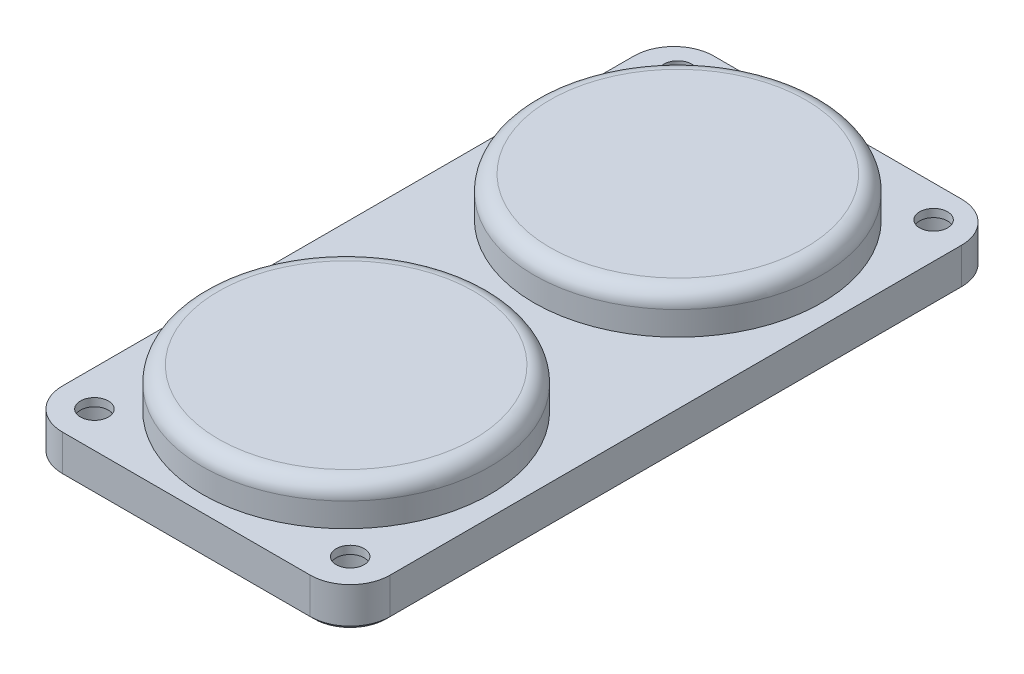
ISO-10303-21;
HEADER;
FILE_DESCRIPTION(('STEP AP214'),'2;1');
FILE_NAME('part.step','',(''),(''),'','','');
FILE_SCHEMA(('AUTOMOTIVE_DESIGN { 1 0 10303 214 1 1 1 1 }'));
ENDSEC;
DATA;
#1=APPLICATION_CONTEXT('core data for automotive mechanical design processes');
#2=APPLICATION_PROTOCOL_DEFINITION('international standard','automotive_design',2000,#1);
#3=PRODUCT_CONTEXT('',#1,'mechanical');
#4=PRODUCT('Part','Part','',(#3));
#5=PRODUCT_RELATED_PRODUCT_CATEGORY('part','',(#4));
#6=PRODUCT_DEFINITION_FORMATION('','',#4);
#7=PRODUCT_DEFINITION_CONTEXT('part definition',#1,'design');
#8=PRODUCT_DEFINITION('design','',#6,#7);
#9=PRODUCT_DEFINITION_SHAPE('','',#8);
#10=(LENGTH_UNIT() NAMED_UNIT(*) SI_UNIT(.MILLI.,.METRE.));
#11=(NAMED_UNIT(*) PLANE_ANGLE_UNIT() SI_UNIT($,.RADIAN.));
#12=(NAMED_UNIT(*) SI_UNIT($,.STERADIAN.) SOLID_ANGLE_UNIT());
#13=UNCERTAINTY_MEASURE_WITH_UNIT(LENGTH_MEASURE(1.E-05),#10,'distance_accuracy_value','');
#14=(GEOMETRIC_REPRESENTATION_CONTEXT(3) GLOBAL_UNCERTAINTY_ASSIGNED_CONTEXT((#13)) GLOBAL_UNIT_ASSIGNED_CONTEXT((#10,
#11,#12)) REPRESENTATION_CONTEXT('',''));
#15=CARTESIAN_POINT('',(0.,0.,0.));
#16=DIRECTION('',(0.,0.,1.));
#17=DIRECTION('',(1.,0.,0.));
#18=AXIS2_PLACEMENT_3D('',#15,#16,#17);
#19=CARTESIAN_POINT('',(-16.,0.,15.5));
#20=DIRECTION('',(0.,-1.,0.));
#21=DIRECTION('',(0.,0.,-1.));
#22=AXIS2_PLACEMENT_3D('',#19,#20,#21);
#23=CYLINDRICAL_SURFACE('',#22,1.75);
#24=CARTESIAN_POINT('',(-16.,0.,15.5));
#25=DIRECTION('',(0.,-1.,0.));
#26=DIRECTION('',(0.,0.,-1.));
#27=AXIS2_PLACEMENT_3D('',#24,#25,#26);
#28=CIRCLE('',#27,1.75);
#29=CARTESIAN_POINT('',(-16.,0.,13.75));
#30=VERTEX_POINT('',#29);
#31=EDGE_CURVE('E147',#30,#30,#28,.T.);
#32=ORIENTED_EDGE('',*,*,#31,.F.);
#33=EDGE_LOOP('',(#32));
#34=FACE_BOUND('',#33,.T.);
#35=CARTESIAN_POINT('',(-16.,-1.,15.5));
#36=DIRECTION('',(0.,-1.,0.));
#37=DIRECTION('',(0.,0.,-1.));
#38=AXIS2_PLACEMENT_3D('',#35,#36,#37);
#39=CIRCLE('',#38,1.75);
#40=CARTESIAN_POINT('',(-16.,-1.,13.75));
#41=VERTEX_POINT('',#40);
#42=EDGE_CURVE('E203',#41,#41,#39,.F.);
#43=ORIENTED_EDGE('',*,*,#42,.F.);
#44=EDGE_LOOP('',(#43));
#45=FACE_BOUND('',#44,.T.);
#46=ADVANCED_FACE('F35',(#34,#45),#23,.F.);
#47=CARTESIAN_POINT('',(-16.,0.,-57.4999999999999));
#48=DIRECTION('',(0.,-1.,0.));
#49=DIRECTION('',(0.,0.,-1.));
#50=AXIS2_PLACEMENT_3D('',#47,#48,#49);
#51=CYLINDRICAL_SURFACE('',#50,1.75);
#52=CARTESIAN_POINT('',(-16.,0.,-57.4999999999999));
#53=DIRECTION('',(0.,-1.,0.));
#54=DIRECTION('',(0.,0.,-1.));
#55=AXIS2_PLACEMENT_3D('',#52,#53,#54);
#56=CIRCLE('',#55,1.75);
#57=CARTESIAN_POINT('',(-16.,0.,-59.2499999999999));
#58=VERTEX_POINT('',#57);
#59=EDGE_CURVE('E144',#58,#58,#56,.T.);
#60=ORIENTED_EDGE('',*,*,#59,.F.);
#61=EDGE_LOOP('',(#60));
#62=FACE_BOUND('',#61,.T.);
#63=CARTESIAN_POINT('',(-16.,-1.,-57.4999999999999));
#64=DIRECTION('',(0.,-1.,0.));
#65=DIRECTION('',(0.,0.,-1.));
#66=AXIS2_PLACEMENT_3D('',#63,#64,#65);
#67=CIRCLE('',#66,1.75);
#68=CARTESIAN_POINT('',(-16.,-1.,-59.2499999999999));
#69=VERTEX_POINT('',#68);
#70=EDGE_CURVE('E200',#69,#69,#67,.F.);
#71=ORIENTED_EDGE('',*,*,#70,.F.);
#72=EDGE_LOOP('',(#71));
#73=FACE_BOUND('',#72,.T.);
#74=ADVANCED_FACE('F303',(#62,#73),#51,.F.);
#75=CARTESIAN_POINT('',(16.,0.,15.5));
#76=DIRECTION('',(0.,-1.,0.));
#77=DIRECTION('',(0.,0.,-1.));
#78=AXIS2_PLACEMENT_3D('',#75,#76,#77);
#79=CYLINDRICAL_SURFACE('',#78,1.75);
#80=CARTESIAN_POINT('',(16.,0.,15.5));
#81=DIRECTION('',(0.,1.,0.));
#82=DIRECTION('',(0.,0.,-1.));
#83=AXIS2_PLACEMENT_3D('',#80,#81,#82);
#84=CIRCLE('',#83,1.75);
#85=CARTESIAN_POINT('',(16.,0.,13.75));
#86=VERTEX_POINT('',#85);
#87=EDGE_CURVE('E280',#86,#86,#84,.T.);
#88=ORIENTED_EDGE('',*,*,#87,.T.);
#89=EDGE_LOOP('',(#88));
#90=FACE_BOUND('',#89,.T.);
#91=CARTESIAN_POINT('',(16.,-1.,15.5));
#92=DIRECTION('',(0.,-1.,0.));
#93=DIRECTION('',(0.,0.,-1.));
#94=AXIS2_PLACEMENT_3D('',#91,#92,#93);
#95=CIRCLE('',#94,1.75);
#96=CARTESIAN_POINT('',(16.,-1.,13.75));
#97=VERTEX_POINT('',#96);
#98=EDGE_CURVE('E196',#97,#97,#95,.T.);
#99=ORIENTED_EDGE('',*,*,#98,.T.);
#100=EDGE_LOOP('',(#99));
#101=FACE_BOUND('',#100,.T.);
#102=ADVANCED_FACE('F287',(#90,#101),#79,.F.);
#103=CARTESIAN_POINT('',(16.,0.,-57.4999999999999));
#104=DIRECTION('',(0.,-1.,0.));
#105=DIRECTION('',(0.,0.,-1.));
#106=AXIS2_PLACEMENT_3D('',#103,#104,#105);
#107=CYLINDRICAL_SURFACE('',#106,1.75);
#108=CARTESIAN_POINT('',(16.,0.,-57.4999999999999));
#109=DIRECTION('',(0.,1.,0.));
#110=DIRECTION('',(0.,0.,-1.));
#111=AXIS2_PLACEMENT_3D('',#108,#109,#110);
#112=CIRCLE('',#111,1.75);
#113=CARTESIAN_POINT('',(16.,0.,-59.2499999999999));
#114=VERTEX_POINT('',#113);
#115=EDGE_CURVE('E281',#114,#114,#112,.T.);
#116=ORIENTED_EDGE('',*,*,#115,.T.);
#117=EDGE_LOOP('',(#116));
#118=FACE_BOUND('',#117,.T.);
#119=CARTESIAN_POINT('',(16.,-1.,-57.4999999999999));
#120=DIRECTION('',(0.,-1.,0.));
#121=DIRECTION('',(0.,0.,-1.));
#122=AXIS2_PLACEMENT_3D('',#119,#120,#121);
#123=CIRCLE('',#122,1.75);
#124=CARTESIAN_POINT('',(16.,-1.,-59.2499999999999));
#125=VERTEX_POINT('',#124);
#126=EDGE_CURVE('E193',#125,#125,#123,.T.);
#127=ORIENTED_EDGE('',*,*,#126,.T.);
#128=EDGE_LOOP('',(#127));
#129=FACE_BOUND('',#128,.T.);
#130=ADVANCED_FACE('F347',(#118,#129),#107,.F.);
#131=CARTESIAN_POINT('',(-15.5,-5.,-56.5));
#132=DIRECTION('',(0.,1.,0.));
#133=DIRECTION('',(0.,0.,1.));
#134=AXIS2_PLACEMENT_3D('',#131,#132,#133);
#135=CYLINDRICAL_SURFACE('',#134,5.);
#136=DIRECTION('',(0.,1.,0.));
#137=VECTOR('',#136,1.);
#138=CARTESIAN_POINT('',(-15.5,-5.,-61.5));
#139=LINE('',#138,#137);
#140=CARTESIAN_POINT('',(-15.5,-4.49999999999999,-61.5));
#141=VERTEX_POINT('',#140);
#142=CARTESIAN_POINT('',(-15.5,0.,-61.5));
#143=VERTEX_POINT('',#142);
#144=EDGE_CURVE('E164',#141,#143,#139,.T.);
#145=ORIENTED_EDGE('',*,*,#144,.F.);
#146=CARTESIAN_POINT('',(-15.5,-4.49999999999999,-56.5));
#147=DIRECTION('',(0.,-1.,0.));
#148=DIRECTION('',(0.,0.,-1.));
#149=AXIS2_PLACEMENT_3D('',#146,#147,#148);
#150=CIRCLE('',#149,5.);
#151=CARTESIAN_POINT('',(-20.5,-4.49999999999999,-56.5));
#152=VERTEX_POINT('',#151);
#153=EDGE_CURVE('E59',#141,#152,#150,.F.);
#154=ORIENTED_EDGE('',*,*,#153,.T.);
#155=DIRECTION('',(0.,1.,0.));
#156=VECTOR('',#155,1.);
#157=CARTESIAN_POINT('',(-20.5,-5.,-56.5));
#158=LINE('',#157,#156);
#159=CARTESIAN_POINT('',(-20.5,0.,-56.5));
#160=VERTEX_POINT('',#159);
#161=EDGE_CURVE('E124',#152,#160,#158,.T.);
#162=ORIENTED_EDGE('',*,*,#161,.T.);
#163=CARTESIAN_POINT('',(-15.5,0.,-56.5));
#164=DIRECTION('',(0.,1.,0.));
#165=DIRECTION('',(0.,0.,-1.));
#166=AXIS2_PLACEMENT_3D('',#163,#164,#165);
#167=CIRCLE('',#166,5.);
#168=EDGE_CURVE('E128',#143,#160,#167,.T.);
#169=ORIENTED_EDGE('',*,*,#168,.F.);
#170=EDGE_LOOP('',(#145,#154,#162,#169));
#171=FACE_BOUND('',#170,.T.);
#172=ADVANCED_FACE('F126',(#171),#135,.T.);
#173=CARTESIAN_POINT('',(-15.5,-5.,-61.5));
#174=DIRECTION('',(0.,0.,-1.));
#175=DIRECTION('',(-1.,0.,0.));
#176=AXIS2_PLACEMENT_3D('',#173,#174,#175);
#177=PLANE('',#176);
#178=DIRECTION('',(0.,1.,0.));
#179=VECTOR('',#178,1.);
#180=CARTESIAN_POINT('',(15.5,-5.,-61.5));
#181=LINE('',#180,#179);
#182=CARTESIAN_POINT('',(15.5,-4.49999999999999,-61.5));
#183=VERTEX_POINT('',#182);
#184=CARTESIAN_POINT('',(15.5,0.,-61.5));
#185=VERTEX_POINT('',#184);
#186=EDGE_CURVE('E167',#183,#185,#181,.T.);
#187=ORIENTED_EDGE('',*,*,#186,.F.);
#188=DIRECTION('',(-1.,0.,0.));
#189=VECTOR('',#188,1.);
#190=CARTESIAN_POINT('',(-15.5,-4.49999999999999,-61.5));
#191=LINE('',#190,#189);
#192=EDGE_CURVE('E230',#183,#141,#191,.T.);
#193=ORIENTED_EDGE('',*,*,#192,.T.);
#194=ORIENTED_EDGE('',*,*,#144,.T.);
#195=DIRECTION('',(-1.,0.,0.));
#196=VECTOR('',#195,1.);
#197=CARTESIAN_POINT('',(-15.5,0.,-61.5));
#198=LINE('',#197,#196);
#199=EDGE_CURVE('E131',#185,#143,#198,.T.);
#200=ORIENTED_EDGE('',*,*,#199,.F.);
#201=EDGE_LOOP('',(#187,#193,#194,#200));
#202=FACE_BOUND('',#201,.T.);
#203=ADVANCED_FACE('F359',(#202),#177,.T.);
#204=CARTESIAN_POINT('',(15.5,-5.,-56.5));
#205=DIRECTION('',(0.,1.,0.));
#206=DIRECTION('',(0.,0.,1.));
#207=AXIS2_PLACEMENT_3D('',#204,#205,#206);
#208=CYLINDRICAL_SURFACE('',#207,5.);
#209=DIRECTION('',(0.,1.,0.));
#210=VECTOR('',#209,1.);
#211=CARTESIAN_POINT('',(20.5,-5.,-56.5));
#212=LINE('',#211,#210);
#213=CARTESIAN_POINT('',(20.5,-4.49999999999999,-56.5));
#214=VERTEX_POINT('',#213);
#215=CARTESIAN_POINT('',(20.5,0.,-56.5));
#216=VERTEX_POINT('',#215);
#217=EDGE_CURVE('E169',#214,#216,#212,.T.);
#218=ORIENTED_EDGE('',*,*,#217,.F.);
#219=CARTESIAN_POINT('',(15.5,-4.49999999999999,-56.5));
#220=DIRECTION('',(0.,-1.,0.));
#221=DIRECTION('',(0.,0.,-1.));
#222=AXIS2_PLACEMENT_3D('',#219,#220,#221);
#223=CIRCLE('',#222,5.);
#224=EDGE_CURVE('E226',#214,#183,#223,.F.);
#225=ORIENTED_EDGE('',*,*,#224,.T.);
#226=ORIENTED_EDGE('',*,*,#186,.T.);
#227=CARTESIAN_POINT('',(15.5,0.,-56.5));
#228=DIRECTION('',(0.,1.,0.));
#229=DIRECTION('',(0.,0.,-1.));
#230=AXIS2_PLACEMENT_3D('',#227,#228,#229);
#231=CIRCLE('',#230,5.);
#232=EDGE_CURVE('E161',#216,#185,#231,.T.);
#233=ORIENTED_EDGE('',*,*,#232,.F.);
#234=EDGE_LOOP('',(#218,#225,#226,#233));
#235=FACE_BOUND('',#234,.T.);
#236=ADVANCED_FACE('F362',(#235),#208,.T.);
#237=CARTESIAN_POINT('',(20.5,-5.,-56.5));
#238=DIRECTION('',(1.,0.,0.));
#239=DIRECTION('',(0.,0.,-1.));
#240=AXIS2_PLACEMENT_3D('',#237,#238,#239);
#241=PLANE('',#240);
#242=DIRECTION('',(0.,1.,0.));
#243=VECTOR('',#242,1.);
#244=CARTESIAN_POINT('',(20.5,-5.,15.));
#245=LINE('',#244,#243);
#246=CARTESIAN_POINT('',(20.5,-4.49999999999999,15.));
#247=VERTEX_POINT('',#246);
#248=CARTESIAN_POINT('',(20.5,0.,15.));
#249=VERTEX_POINT('',#248);
#250=EDGE_CURVE('E171',#247,#249,#245,.T.);
#251=ORIENTED_EDGE('',*,*,#250,.F.);
#252=DIRECTION('',(0.,0.,-1.));
#253=VECTOR('',#252,1.);
#254=CARTESIAN_POINT('',(20.5,-4.49999999999999,-56.5));
#255=LINE('',#254,#253);
#256=EDGE_CURVE('E192',#247,#214,#255,.T.);
#257=ORIENTED_EDGE('',*,*,#256,.T.);
#258=ORIENTED_EDGE('',*,*,#217,.T.);
#259=DIRECTION('',(0.,0.,-1.));
#260=VECTOR('',#259,1.);
#261=CARTESIAN_POINT('',(20.5,0.,-56.5));
#262=LINE('',#261,#260);
#263=EDGE_CURVE('E158',#249,#216,#262,.T.);
#264=ORIENTED_EDGE('',*,*,#263,.F.);
#265=EDGE_LOOP('',(#251,#257,#258,#264));
#266=FACE_BOUND('',#265,.T.);
#267=ADVANCED_FACE('F366',(#266),#241,.T.);
#268=CARTESIAN_POINT('',(15.5,-5.,15.));
#269=DIRECTION('',(0.,1.,0.));
#270=DIRECTION('',(0.,0.,1.));
#271=AXIS2_PLACEMENT_3D('',#268,#269,#270);
#272=CYLINDRICAL_SURFACE('',#271,5.);
#273=DIRECTION('',(0.,1.,0.));
#274=VECTOR('',#273,1.);
#275=CARTESIAN_POINT('',(15.5,-5.,20.));
#276=LINE('',#275,#274);
#277=CARTESIAN_POINT('',(15.5,-4.49999999999999,20.));
#278=VERTEX_POINT('',#277);
#279=CARTESIAN_POINT('',(15.5,0.,20.));
#280=VERTEX_POINT('',#279);
#281=EDGE_CURVE('E173',#278,#280,#276,.T.);
#282=ORIENTED_EDGE('',*,*,#281,.F.);
#283=CARTESIAN_POINT('',(15.5,-4.49999999999999,15.));
#284=DIRECTION('',(0.,-1.,0.));
#285=DIRECTION('',(0.,0.,-1.));
#286=AXIS2_PLACEMENT_3D('',#283,#284,#285);
#287=CIRCLE('',#286,5.);
#288=EDGE_CURVE('E228',#278,#247,#287,.F.);
#289=ORIENTED_EDGE('',*,*,#288,.T.);
#290=ORIENTED_EDGE('',*,*,#250,.T.);
#291=CARTESIAN_POINT('',(15.5,0.,15.));
#292=DIRECTION('',(0.,1.,0.));
#293=DIRECTION('',(0.,0.,-1.));
#294=AXIS2_PLACEMENT_3D('',#291,#292,#293);
#295=CIRCLE('',#294,5.);
#296=EDGE_CURVE('E155',#280,#249,#295,.T.);
#297=ORIENTED_EDGE('',*,*,#296,.F.);
#298=EDGE_LOOP('',(#282,#289,#290,#297));
#299=FACE_BOUND('',#298,.T.);
#300=ADVANCED_FACE('F370',(#299),#272,.T.);
#301=CARTESIAN_POINT('',(15.5,-5.,20.));
#302=DIRECTION('',(0.,0.,1.));
#303=DIRECTION('',(1.,0.,0.));
#304=AXIS2_PLACEMENT_3D('',#301,#302,#303);
#305=PLANE('',#304);
#306=DIRECTION('',(0.,1.,0.));
#307=VECTOR('',#306,1.);
#308=CARTESIAN_POINT('',(-15.5,-5.,20.));
#309=LINE('',#308,#307);
#310=CARTESIAN_POINT('',(-15.5,-4.49999999999999,20.));
#311=VERTEX_POINT('',#310);
#312=CARTESIAN_POINT('',(-15.5,0.,20.));
#313=VERTEX_POINT('',#312);
#314=EDGE_CURVE('E175',#311,#313,#309,.T.);
#315=ORIENTED_EDGE('',*,*,#314,.F.);
#316=DIRECTION('',(1.,0.,0.));
#317=VECTOR('',#316,1.);
#318=CARTESIAN_POINT('',(15.5,-4.49999999999999,20.));
#319=LINE('',#318,#317);
#320=EDGE_CURVE('E232',#311,#278,#319,.T.);
#321=ORIENTED_EDGE('',*,*,#320,.T.);
#322=ORIENTED_EDGE('',*,*,#281,.T.);
#323=DIRECTION('',(1.,0.,0.));
#324=VECTOR('',#323,1.);
#325=CARTESIAN_POINT('',(15.5,0.,20.));
#326=LINE('',#325,#324);
#327=EDGE_CURVE('E152',#313,#280,#326,.T.);
#328=ORIENTED_EDGE('',*,*,#327,.F.);
#329=EDGE_LOOP('',(#315,#321,#322,#328));
#330=FACE_BOUND('',#329,.T.);
#331=ADVANCED_FACE('F374',(#330),#305,.T.);
#332=CARTESIAN_POINT('',(-15.5,-5.,15.));
#333=DIRECTION('',(0.,1.,0.));
#334=DIRECTION('',(0.,0.,1.));
#335=AXIS2_PLACEMENT_3D('',#332,#333,#334);
#336=CYLINDRICAL_SURFACE('',#335,5.);
#337=DIRECTION('',(0.,1.,0.));
#338=VECTOR('',#337,1.);
#339=CARTESIAN_POINT('',(-20.5,-5.,15.));
#340=LINE('',#339,#338);
#341=CARTESIAN_POINT('',(-20.5,-4.49999999999999,15.));
#342=VERTEX_POINT('',#341);
#343=CARTESIAN_POINT('',(-20.5,0.,15.));
#344=VERTEX_POINT('',#343);
#345=EDGE_CURVE('E130',#342,#344,#340,.T.);
#346=ORIENTED_EDGE('',*,*,#345,.F.);
#347=CARTESIAN_POINT('',(-15.5,-4.49999999999999,15.));
#348=DIRECTION('',(0.,-1.,0.));
#349=DIRECTION('',(0.,0.,-1.));
#350=AXIS2_PLACEMENT_3D('',#347,#348,#349);
#351=CIRCLE('',#350,5.);
#352=EDGE_CURVE('E45',#342,#311,#351,.F.);
#353=ORIENTED_EDGE('',*,*,#352,.T.);
#354=ORIENTED_EDGE('',*,*,#314,.T.);
#355=CARTESIAN_POINT('',(-15.5,0.,15.));
#356=DIRECTION('',(0.,1.,0.));
#357=DIRECTION('',(0.,0.,1.));
#358=AXIS2_PLACEMENT_3D('',#355,#356,#357);
#359=CIRCLE('',#358,5.);
#360=EDGE_CURVE('E139',#344,#313,#359,.T.);
#361=ORIENTED_EDGE('',*,*,#360,.F.);
#362=EDGE_LOOP('',(#346,#353,#354,#361));
#363=FACE_BOUND('',#362,.T.);
#364=ADVANCED_FACE('F378',(#363),#336,.T.);
#365=CARTESIAN_POINT('',(-20.5,-5.,-56.5));
#366=DIRECTION('',(-1.,0.,0.));
#367=DIRECTION('',(0.,0.,1.));
#368=AXIS2_PLACEMENT_3D('',#365,#366,#367);
#369=PLANE('',#368);
#370=ORIENTED_EDGE('',*,*,#161,.F.);
#371=DIRECTION('',(0.,0.,1.));
#372=VECTOR('',#371,1.);
#373=CARTESIAN_POINT('',(-20.5,-4.49999999999999,-56.5));
#374=LINE('',#373,#372);
#375=EDGE_CURVE('E11',#152,#342,#374,.T.);
#376=ORIENTED_EDGE('',*,*,#375,.T.);
#377=ORIENTED_EDGE('',*,*,#345,.T.);
#378=DIRECTION('',(0.,0.,1.));
#379=VECTOR('',#378,1.);
#380=CARTESIAN_POINT('',(-20.5,0.,-56.5));
#381=LINE('',#380,#379);
#382=EDGE_CURVE('E134',#160,#344,#381,.T.);
#383=ORIENTED_EDGE('',*,*,#382,.F.);
#384=EDGE_LOOP('',(#370,#376,#377,#383));
#385=FACE_BOUND('',#384,.T.);
#386=ADVANCED_FACE('F135',(#385),#369,.T.);
#387=CARTESIAN_POINT('',(-15.5,-5.,-56.5));
#388=DIRECTION('',(0.,-1.,0.));
#389=DIRECTION('',(0.,0.,-1.));
#390=AXIS2_PLACEMENT_3D('',#387,#388,#389);
#391=PLANE('',#390);
#392=CARTESIAN_POINT('',(15.5,-5.,-56.5));
#393=DIRECTION('',(0.,-1.,0.));
#394=DIRECTION('',(0.,0.,-1.));
#395=AXIS2_PLACEMENT_3D('',#392,#393,#394);
#396=CIRCLE('',#395,4.49999999999998);
#397=CARTESIAN_POINT('',(15.5,-5.,-61.));
#398=VERTEX_POINT('',#397);
#399=CARTESIAN_POINT('',(20.,-5.,-56.5));
#400=VERTEX_POINT('',#399);
#401=EDGE_CURVE('E221',#398,#400,#396,.T.);
#402=ORIENTED_EDGE('',*,*,#401,.T.);
#403=DIRECTION('',(0.,0.,1.));
#404=VECTOR('',#403,1.);
#405=CARTESIAN_POINT('',(20.,-5.,-56.5));
#406=LINE('',#405,#404);
#407=CARTESIAN_POINT('',(20.,-5.,15.));
#408=VERTEX_POINT('',#407);
#409=EDGE_CURVE('E223',#400,#408,#406,.T.);
#410=ORIENTED_EDGE('',*,*,#409,.T.);
#411=CARTESIAN_POINT('',(15.5,-5.,15.));
#412=DIRECTION('',(0.,-1.,0.));
#413=DIRECTION('',(0.,0.,-1.));
#414=AXIS2_PLACEMENT_3D('',#411,#412,#413);
#415=CIRCLE('',#414,4.49999999999998);
#416=CARTESIAN_POINT('',(15.5,-5.,19.5));
#417=VERTEX_POINT('',#416);
#418=EDGE_CURVE('E219',#408,#417,#415,.T.);
#419=ORIENTED_EDGE('',*,*,#418,.T.);
#420=DIRECTION('',(-1.,0.,0.));
#421=VECTOR('',#420,1.);
#422=CARTESIAN_POINT('',(-15.5,-5.,19.5));
#423=LINE('',#422,#421);
#424=CARTESIAN_POINT('',(-15.5,-5.,19.5));
#425=VERTEX_POINT('',#424);
#426=EDGE_CURVE('E215',#417,#425,#423,.T.);
#427=ORIENTED_EDGE('',*,*,#426,.T.);
#428=CARTESIAN_POINT('',(-15.5,-5.,15.));
#429=DIRECTION('',(0.,-1.,0.));
#430=DIRECTION('',(0.,0.,-1.));
#431=AXIS2_PLACEMENT_3D('',#428,#429,#430);
#432=CIRCLE('',#431,4.49999999999998);
#433=CARTESIAN_POINT('',(-20.,-5.,15.));
#434=VERTEX_POINT('',#433);
#435=EDGE_CURVE('E211',#425,#434,#432,.T.);
#436=ORIENTED_EDGE('',*,*,#435,.T.);
#437=DIRECTION('',(0.,0.,-1.));
#438=VECTOR('',#437,1.);
#439=CARTESIAN_POINT('',(-20.,-5.,-56.5));
#440=LINE('',#439,#438);
#441=CARTESIAN_POINT('',(-20.,-5.,-56.5));
#442=VERTEX_POINT('',#441);
#443=EDGE_CURVE('E209',#434,#442,#440,.T.);
#444=ORIENTED_EDGE('',*,*,#443,.T.);
#445=CARTESIAN_POINT('',(-15.5,-5.,-56.5));
#446=DIRECTION('',(0.,-1.,0.));
#447=DIRECTION('',(0.,0.,-1.));
#448=AXIS2_PLACEMENT_3D('',#445,#446,#447);
#449=CIRCLE('',#448,4.49999999999999);
#450=CARTESIAN_POINT('',(-15.5,-5.,-61.));
#451=VERTEX_POINT('',#450);
#452=EDGE_CURVE('E213',#442,#451,#449,.T.);
#453=ORIENTED_EDGE('',*,*,#452,.T.);
#454=DIRECTION('',(1.,0.,0.));
#455=VECTOR('',#454,1.);
#456=CARTESIAN_POINT('',(-15.5,-5.,-61.));
#457=LINE('',#456,#455);
#458=EDGE_CURVE('E217',#451,#398,#457,.T.);
#459=ORIENTED_EDGE('',*,*,#458,.T.);
#460=EDGE_LOOP('',(#402,#410,#419,#427,#436,#444,#453,#459));
#461=FACE_BOUND('',#460,.T.);
#462=CARTESIAN_POINT('',(-16.,-5.,15.5));
#463=DIRECTION('',(0.,-1.,0.));
#464=DIRECTION('',(0.,0.,-1.));
#465=AXIS2_PLACEMENT_3D('',#462,#463,#464);
#466=CIRCLE('',#465,3.25);
#467=CARTESIAN_POINT('',(-16.,-5.,12.25));
#468=VERTEX_POINT('',#467);
#469=EDGE_CURVE('E257',#468,#468,#466,.T.);
#470=ORIENTED_EDGE('',*,*,#469,.F.);
#471=EDGE_LOOP('',(#470));
#472=FACE_BOUND('',#471,.T.);
#473=CARTESIAN_POINT('',(16.,-5.,15.5));
#474=DIRECTION('',(0.,-1.,0.));
#475=DIRECTION('',(0.,0.,-1.));
#476=AXIS2_PLACEMENT_3D('',#473,#474,#475);
#477=CIRCLE('',#476,3.25);
#478=CARTESIAN_POINT('',(16.,-5.,12.25));
#479=VERTEX_POINT('',#478);
#480=EDGE_CURVE('E268',#479,#479,#477,.T.);
#481=ORIENTED_EDGE('',*,*,#480,.F.);
#482=EDGE_LOOP('',(#481));
#483=FACE_BOUND('',#482,.T.);
#484=CARTESIAN_POINT('',(16.,-5.,-57.4999999999999));
#485=DIRECTION('',(0.,-1.,0.));
#486=DIRECTION('',(0.,0.,-1.));
#487=AXIS2_PLACEMENT_3D('',#484,#485,#486);
#488=CIRCLE('',#487,3.25000000000001);
#489=CARTESIAN_POINT('',(16.,-5.,-60.75));
#490=VERTEX_POINT('',#489);
#491=EDGE_CURVE('E479',#490,#490,#488,.T.);
#492=ORIENTED_EDGE('',*,*,#491,.F.);
#493=EDGE_LOOP('',(#492));
#494=FACE_BOUND('',#493,.T.);
#495=CARTESIAN_POINT('',(-16.,-5.,-57.4999999999999));
#496=DIRECTION('',(0.,-1.,0.));
#497=DIRECTION('',(0.,0.,-1.));
#498=AXIS2_PLACEMENT_3D('',#495,#496,#497);
#499=CIRCLE('',#498,3.25);
#500=CARTESIAN_POINT('',(-16.,-5.,-60.7499999999999));
#501=VERTEX_POINT('',#500);
#502=EDGE_CURVE('E274',#501,#501,#499,.T.);
#503=ORIENTED_EDGE('',*,*,#502,.F.);
#504=EDGE_LOOP('',(#503));
#505=FACE_BOUND('',#504,.T.);
#506=ADVANCED_FACE('F293',(#461,#472,#483,#494,#505),#391,.T.);
#507=CARTESIAN_POINT('',(-15.5,0.,-56.5));
#508=DIRECTION('',(0.,-1.,0.));
#509=DIRECTION('',(0.,0.,-1.));
#510=AXIS2_PLACEMENT_3D('',#507,#508,#509);
#511=PLANE('',#510);
#512=CARTESIAN_POINT('',(0.,0.,0.));
#513=DIRECTION('',(0.,-1.,0.));
#514=DIRECTION('',(0.,0.,-1.));
#515=AXIS2_PLACEMENT_3D('',#512,#513,#514);
#516=CIRCLE('',#515,18.);
#517=CARTESIAN_POINT('',(0.,0.,-18.0000000000001));
#518=VERTEX_POINT('',#517);
#519=EDGE_CURVE('E206',#518,#518,#516,.T.);
#520=ORIENTED_EDGE('',*,*,#519,.T.);
#521=EDGE_LOOP('',(#520));
#522=FACE_BOUND('',#521,.T.);
#523=CARTESIAN_POINT('',(0.,0.,-41.5));
#524=DIRECTION('',(0.,-1.,0.));
#525=DIRECTION('',(0.,0.,-1.));
#526=AXIS2_PLACEMENT_3D('',#523,#524,#525);
#527=CIRCLE('',#526,18.);
#528=CARTESIAN_POINT('',(0.,0.,-59.5));
#529=VERTEX_POINT('',#528);
#530=EDGE_CURVE('E166',#529,#529,#527,.F.);
#531=ORIENTED_EDGE('',*,*,#530,.F.);
#532=EDGE_LOOP('',(#531));
#533=FACE_BOUND('',#532,.T.);
#534=ORIENTED_EDGE('',*,*,#115,.F.);
#535=EDGE_LOOP('',(#534));
#536=FACE_BOUND('',#535,.T.);
#537=ORIENTED_EDGE('',*,*,#87,.F.);
#538=EDGE_LOOP('',(#537));
#539=FACE_BOUND('',#538,.T.);
#540=ORIENTED_EDGE('',*,*,#59,.T.);
#541=EDGE_LOOP('',(#540));
#542=FACE_BOUND('',#541,.T.);
#543=ORIENTED_EDGE('',*,*,#31,.T.);
#544=EDGE_LOOP('',(#543));
#545=FACE_BOUND('',#544,.T.);
#546=ORIENTED_EDGE('',*,*,#168,.T.);
#547=ORIENTED_EDGE('',*,*,#382,.T.);
#548=ORIENTED_EDGE('',*,*,#360,.T.);
#549=ORIENTED_EDGE('',*,*,#327,.T.);
#550=ORIENTED_EDGE('',*,*,#296,.T.);
#551=ORIENTED_EDGE('',*,*,#263,.T.);
#552=ORIENTED_EDGE('',*,*,#232,.T.);
#553=ORIENTED_EDGE('',*,*,#199,.T.);
#554=EDGE_LOOP('',(#546,#547,#548,#549,#550,#551,#552,#553));
#555=FACE_BOUND('',#554,.T.);
#556=ADVANCED_FACE('F141',(#522,#533,#536,#539,#542,#545,#555),#511,.F.);
#557=CARTESIAN_POINT('',(0.,5.,-41.5));
#558=DIRECTION('',(0.,-1.,0.));
#559=DIRECTION('',(0.,0.,-1.));
#560=AXIS2_PLACEMENT_3D('',#557,#558,#559);
#561=CYLINDRICAL_SURFACE('',#560,18.);
#562=CARTESIAN_POINT('',(0.,3.,-41.5));
#563=DIRECTION('',(0.,1.,0.));
#564=DIRECTION('',(0.,0.,1.));
#565=AXIS2_PLACEMENT_3D('',#562,#563,#564);
#566=CIRCLE('',#565,18.);
#567=CARTESIAN_POINT('',(0.,3.,-23.5));
#568=VERTEX_POINT('',#567);
#569=EDGE_CURVE('E183',#568,#568,#566,.F.);
#570=ORIENTED_EDGE('',*,*,#569,.T.);
#571=EDGE_LOOP('',(#570));
#572=FACE_BOUND('',#571,.T.);
#573=ORIENTED_EDGE('',*,*,#530,.T.);
#574=EDGE_LOOP('',(#573));
#575=FACE_BOUND('',#574,.T.);
#576=ADVANCED_FACE('F292',(#572,#575),#561,.T.);
#577=CARTESIAN_POINT('',(0.,5.,-41.5));
#578=DIRECTION('',(0.,1.,0.));
#579=DIRECTION('',(0.,0.,1.));
#580=AXIS2_PLACEMENT_3D('',#577,#578,#579);
#581=PLANE('',#580);
#582=CARTESIAN_POINT('',(0.,5.,-41.5));
#583=DIRECTION('',(0.,1.,0.));
#584=DIRECTION('',(0.,0.,1.));
#585=AXIS2_PLACEMENT_3D('',#582,#583,#584);
#586=CIRCLE('',#585,16.);
#587=CARTESIAN_POINT('',(0.,5.,-25.5));
#588=VERTEX_POINT('',#587);
#589=EDGE_CURVE('E180',#588,#588,#586,.T.);
#590=ORIENTED_EDGE('',*,*,#589,.T.);
#591=EDGE_LOOP('',(#590));
#592=FACE_BOUND('',#591,.T.);
#593=ADVANCED_FACE('F340',(#592),#581,.T.);
#594=CARTESIAN_POINT('',(0.,3.,-41.5));
#595=DIRECTION('',(0.,1.,0.));
#596=DIRECTION('',(0.,0.,1.));
#597=AXIS2_PLACEMENT_3D('',#594,#595,#596);
#598=TOROIDAL_SURFACE('',#597,16.,2.);
#599=ORIENTED_EDGE('',*,*,#569,.F.);
#600=EDGE_LOOP('',(#599));
#601=FACE_BOUND('',#600,.T.);
#602=ORIENTED_EDGE('',*,*,#589,.F.);
#603=EDGE_LOOP('',(#602));
#604=FACE_BOUND('',#603,.T.);
#605=ADVANCED_FACE('F338',(#601,#604),#598,.T.);
#606=CARTESIAN_POINT('',(0.,5.,0.));
#607=DIRECTION('',(0.,-1.,0.));
#608=DIRECTION('',(0.,0.,-1.));
#609=AXIS2_PLACEMENT_3D('',#606,#607,#608);
#610=CYLINDRICAL_SURFACE('',#609,18.);
#611=CARTESIAN_POINT('',(0.,3.,0.));
#612=DIRECTION('',(0.,1.,0.));
#613=DIRECTION('',(0.,0.,1.));
#614=AXIS2_PLACEMENT_3D('',#611,#612,#613);
#615=CIRCLE('',#614,18.);
#616=CARTESIAN_POINT('',(0.,3.,18.));
#617=VERTEX_POINT('',#616);
#618=EDGE_CURVE('E186',#617,#617,#615,.F.);
#619=ORIENTED_EDGE('',*,*,#618,.T.);
#620=EDGE_LOOP('',(#619));
#621=FACE_BOUND('',#620,.T.);
#622=ORIENTED_EDGE('',*,*,#519,.F.);
#623=EDGE_LOOP('',(#622));
#624=FACE_BOUND('',#623,.T.);
#625=ADVANCED_FACE('F334',(#621,#624),#610,.T.);
#626=CARTESIAN_POINT('',(0.,5.,0.));
#627=DIRECTION('',(0.,1.,0.));
#628=DIRECTION('',(0.,0.,-1.));
#629=AXIS2_PLACEMENT_3D('',#626,#627,#628);
#630=PLANE('',#629);
#631=CARTESIAN_POINT('',(0.,5.,0.));
#632=DIRECTION('',(0.,1.,0.));
#633=DIRECTION('',(0.,0.,1.));
#634=AXIS2_PLACEMENT_3D('',#631,#632,#633);
#635=CIRCLE('',#634,16.);
#636=CARTESIAN_POINT('',(0.,5.,16.));
#637=VERTEX_POINT('',#636);
#638=EDGE_CURVE('E189',#637,#637,#635,.T.);
#639=ORIENTED_EDGE('',*,*,#638,.T.);
#640=EDGE_LOOP('',(#639));
#641=FACE_BOUND('',#640,.T.);
#642=ADVANCED_FACE('F330',(#641),#630,.T.);
#643=CARTESIAN_POINT('',(0.,3.,0.));
#644=DIRECTION('',(0.,1.,0.));
#645=DIRECTION('',(0.,0.,1.));
#646=AXIS2_PLACEMENT_3D('',#643,#644,#645);
#647=TOROIDAL_SURFACE('',#646,16.,2.);
#648=ORIENTED_EDGE('',*,*,#638,.F.);
#649=EDGE_LOOP('',(#648));
#650=FACE_BOUND('',#649,.T.);
#651=ORIENTED_EDGE('',*,*,#618,.F.);
#652=EDGE_LOOP('',(#651));
#653=FACE_BOUND('',#652,.T.);
#654=ADVANCED_FACE('F333',(#650,#653),#647,.T.);
#655=CARTESIAN_POINT('',(16.,-1.,-57.4999999999999));
#656=DIRECTION('',(0.,-1.,0.));
#657=DIRECTION('',(0.,0.,-1.));
#658=AXIS2_PLACEMENT_3D('',#655,#656,#657);
#659=CYLINDRICAL_SURFACE('',#658,3.25000000000001);
#660=CARTESIAN_POINT('',(16.,-1.,-57.4999999999999));
#661=DIRECTION('',(0.,-1.,0.));
#662=DIRECTION('',(0.,0.,-1.));
#663=AXIS2_PLACEMENT_3D('',#660,#661,#662);
#664=CIRCLE('',#663,3.25000000000001);
#665=CARTESIAN_POINT('',(16.,-1.,-60.75));
#666=VERTEX_POINT('',#665);
#667=EDGE_CURVE('E277',#666,#666,#664,.T.);
#668=ORIENTED_EDGE('',*,*,#667,.F.);
#669=EDGE_LOOP('',(#668));
#670=FACE_BOUND('',#669,.T.);
#671=ORIENTED_EDGE('',*,*,#491,.T.);
#672=EDGE_LOOP('',(#671));
#673=FACE_BOUND('',#672,.T.);
#674=ADVANCED_FACE('F392',(#670,#673),#659,.F.);
#675=CARTESIAN_POINT('',(16.,-1.,-57.4999999999999));
#676=DIRECTION('',(0.,-1.,0.));
#677=DIRECTION('',(0.,0.,-1.));
#678=AXIS2_PLACEMENT_3D('',#675,#676,#677);
#679=PLANE('',#678);
#680=ORIENTED_EDGE('',*,*,#126,.F.);
#681=EDGE_LOOP('',(#680));
#682=FACE_BOUND('',#681,.T.);
#683=ORIENTED_EDGE('',*,*,#667,.T.);
#684=EDGE_LOOP('',(#683));
#685=FACE_BOUND('',#684,.T.);
#686=ADVANCED_FACE('F491',(#682,#685),#679,.T.);
#687=CARTESIAN_POINT('',(16.,-1.,15.5));
#688=DIRECTION('',(0.,-1.,0.));
#689=DIRECTION('',(0.,0.,-1.));
#690=AXIS2_PLACEMENT_3D('',#687,#688,#689);
#691=CYLINDRICAL_SURFACE('',#690,3.25);
#692=CARTESIAN_POINT('',(16.,-1.,15.5));
#693=DIRECTION('',(0.,-1.,0.));
#694=DIRECTION('',(0.,0.,-1.));
#695=AXIS2_PLACEMENT_3D('',#692,#693,#694);
#696=CIRCLE('',#695,3.25);
#697=CARTESIAN_POINT('',(16.,-1.,12.25));
#698=VERTEX_POINT('',#697);
#699=EDGE_CURVE('E483',#698,#698,#696,.T.);
#700=ORIENTED_EDGE('',*,*,#699,.F.);
#701=EDGE_LOOP('',(#700));
#702=FACE_BOUND('',#701,.T.);
#703=ORIENTED_EDGE('',*,*,#480,.T.);
#704=EDGE_LOOP('',(#703));
#705=FACE_BOUND('',#704,.T.);
#706=ADVANCED_FACE('F323',(#702,#705),#691,.F.);
#707=CARTESIAN_POINT('',(16.,-1.,15.5));
#708=DIRECTION('',(0.,-1.,0.));
#709=DIRECTION('',(0.,0.,-1.));
#710=AXIS2_PLACEMENT_3D('',#707,#708,#709);
#711=PLANE('',#710);
#712=ORIENTED_EDGE('',*,*,#98,.F.);
#713=EDGE_LOOP('',(#712));
#714=FACE_BOUND('',#713,.T.);
#715=ORIENTED_EDGE('',*,*,#699,.T.);
#716=EDGE_LOOP('',(#715));
#717=FACE_BOUND('',#716,.T.);
#718=ADVANCED_FACE('F327',(#714,#717),#711,.T.);
#719=CARTESIAN_POINT('',(-16.,-1.,-57.4999999999999));
#720=DIRECTION('',(0.,-1.,0.));
#721=DIRECTION('',(0.,0.,-1.));
#722=AXIS2_PLACEMENT_3D('',#719,#720,#721);
#723=PLANE('',#722);
#724=CARTESIAN_POINT('',(-16.,-1.,-57.4999999999999));
#725=DIRECTION('',(0.,-1.,0.));
#726=DIRECTION('',(0.,0.,-1.));
#727=AXIS2_PLACEMENT_3D('',#724,#725,#726);
#728=CIRCLE('',#727,3.25);
#729=CARTESIAN_POINT('',(-16.,-1.,-60.7499999999999));
#730=VERTEX_POINT('',#729);
#731=EDGE_CURVE('E197',#730,#730,#728,.T.);
#732=ORIENTED_EDGE('',*,*,#731,.T.);
#733=EDGE_LOOP('',(#732));
#734=FACE_BOUND('',#733,.T.);
#735=ORIENTED_EDGE('',*,*,#70,.T.);
#736=EDGE_LOOP('',(#735));
#737=FACE_BOUND('',#736,.T.);
#738=ADVANCED_FACE('F319',(#734,#737),#723,.T.);
#739=CARTESIAN_POINT('',(-16.,-1.,-57.4999999999999));
#740=DIRECTION('',(0.,-1.,0.));
#741=DIRECTION('',(0.,0.,-1.));
#742=AXIS2_PLACEMENT_3D('',#739,#740,#741);
#743=CYLINDRICAL_SURFACE('',#742,3.25);
#744=ORIENTED_EDGE('',*,*,#731,.F.);
#745=EDGE_LOOP('',(#744));
#746=FACE_BOUND('',#745,.T.);
#747=ORIENTED_EDGE('',*,*,#502,.T.);
#748=EDGE_LOOP('',(#747));
#749=FACE_BOUND('',#748,.T.);
#750=ADVANCED_FACE('F310',(#746,#749),#743,.F.);
#751=CARTESIAN_POINT('',(-16.,-1.,15.5));
#752=DIRECTION('',(0.,-1.,0.));
#753=DIRECTION('',(0.,0.,-1.));
#754=AXIS2_PLACEMENT_3D('',#751,#752,#753);
#755=PLANE('',#754);
#756=CARTESIAN_POINT('',(-16.,-1.,15.5));
#757=DIRECTION('',(0.,-1.,0.));
#758=DIRECTION('',(0.,0.,-1.));
#759=AXIS2_PLACEMENT_3D('',#756,#757,#758);
#760=CIRCLE('',#759,3.25);
#761=CARTESIAN_POINT('',(-16.,-1.,12.25));
#762=VERTEX_POINT('',#761);
#763=EDGE_CURVE('E263',#762,#762,#760,.T.);
#764=ORIENTED_EDGE('',*,*,#763,.T.);
#765=EDGE_LOOP('',(#764));
#766=FACE_BOUND('',#765,.T.);
#767=ORIENTED_EDGE('',*,*,#42,.T.);
#768=EDGE_LOOP('',(#767));
#769=FACE_BOUND('',#768,.T.);
#770=ADVANCED_FACE('F307',(#766,#769),#755,.T.);
#771=CARTESIAN_POINT('',(-16.,-1.,15.5));
#772=DIRECTION('',(0.,-1.,0.));
#773=DIRECTION('',(0.,0.,-1.));
#774=AXIS2_PLACEMENT_3D('',#771,#772,#773);
#775=CYLINDRICAL_SURFACE('',#774,3.25);
#776=ORIENTED_EDGE('',*,*,#763,.F.);
#777=EDGE_LOOP('',(#776));
#778=FACE_BOUND('',#777,.T.);
#779=ORIENTED_EDGE('',*,*,#469,.T.);
#780=EDGE_LOOP('',(#779));
#781=FACE_BOUND('',#780,.T.);
#782=ADVANCED_FACE('F309',(#778,#781),#775,.F.);
#783=CARTESIAN_POINT('',(-20.5,-4.49999999999999,-56.5));
#784=DIRECTION('',(0.707106781186548,0.707106781186548,0.));
#785=DIRECTION('',(0.,0.,1.));
#786=AXIS2_PLACEMENT_3D('',#783,#784,#785);
#787=PLANE('',#786);
#788=DIRECTION('',(-0.707106781186548,0.707106781186548,0.));
#789=VECTOR('',#788,1.);
#790=CARTESIAN_POINT('',(-20.,-5.,-56.5));
#791=LINE('',#790,#789);
#792=EDGE_CURVE('E251',#442,#152,#791,.T.);
#793=ORIENTED_EDGE('',*,*,#792,.F.);
#794=ORIENTED_EDGE('',*,*,#443,.F.);
#795=DIRECTION('',(0.707106781186548,-0.707106781186548,0.));
#796=VECTOR('',#795,1.);
#797=CARTESIAN_POINT('',(-20.5,-4.49999999999999,15.));
#798=LINE('',#797,#796);
#799=EDGE_CURVE('E40',#342,#434,#798,.T.);
#800=ORIENTED_EDGE('',*,*,#799,.F.);
#801=ORIENTED_EDGE('',*,*,#375,.F.);
#802=EDGE_LOOP('',(#793,#794,#800,#801));
#803=FACE_BOUND('',#802,.T.);
#804=ADVANCED_FACE('F38',(#803),#787,.F.);
#805=CARTESIAN_POINT('',(-15.5,-4.49999999999999,15.));
#806=DIRECTION('',(0.,1.,0.));
#807=DIRECTION('',(0.,0.,1.));
#808=AXIS2_PLACEMENT_3D('',#805,#806,#807);
#809=CONICAL_SURFACE('',#808,5.,0.78539816339745);
#810=ORIENTED_EDGE('',*,*,#799,.T.);
#811=ORIENTED_EDGE('',*,*,#435,.F.);
#812=DIRECTION('',(0.,-0.707106781186545,-0.70710678118655));
#813=VECTOR('',#812,1.);
#814=CARTESIAN_POINT('',(-15.5,-4.49999999999999,20.));
#815=LINE('',#814,#813);
#816=EDGE_CURVE('E249',#311,#425,#815,.T.);
#817=ORIENTED_EDGE('',*,*,#816,.F.);
#818=ORIENTED_EDGE('',*,*,#352,.F.);
#819=EDGE_LOOP('',(#810,#811,#817,#818));
#820=FACE_BOUND('',#819,.T.);
#821=ADVANCED_FACE('F435',(#820),#809,.T.);
#822=CARTESIAN_POINT('',(-15.5,-4.49999999999999,-56.5));
#823=DIRECTION('',(0.,1.,0.));
#824=DIRECTION('',(0.,0.,1.));
#825=AXIS2_PLACEMENT_3D('',#822,#823,#824);
#826=CONICAL_SURFACE('',#825,5.,0.785398163397446);
#827=ORIENTED_EDGE('',*,*,#792,.T.);
#828=ORIENTED_EDGE('',*,*,#153,.F.);
#829=DIRECTION('',(0.,0.707106781186548,-0.707106781186548));
#830=VECTOR('',#829,1.);
#831=CARTESIAN_POINT('',(-15.5,-5.,-61.));
#832=LINE('',#831,#830);
#833=EDGE_CURVE('E246',#451,#141,#832,.T.);
#834=ORIENTED_EDGE('',*,*,#833,.F.);
#835=ORIENTED_EDGE('',*,*,#452,.F.);
#836=EDGE_LOOP('',(#827,#828,#834,#835));
#837=FACE_BOUND('',#836,.T.);
#838=ADVANCED_FACE('F429',(#837),#826,.T.);
#839=CARTESIAN_POINT('',(15.5,-4.49999999999999,20.));
#840=DIRECTION('',(0.,0.707106781186545,-0.70710678118655));
#841=DIRECTION('',(1.,0.,0.));
#842=AXIS2_PLACEMENT_3D('',#839,#840,#841);
#843=PLANE('',#842);
#844=ORIENTED_EDGE('',*,*,#816,.T.);
#845=ORIENTED_EDGE('',*,*,#426,.F.);
#846=DIRECTION('',(0.,-0.70710678118655,-0.707106781186545));
#847=VECTOR('',#846,1.);
#848=CARTESIAN_POINT('',(15.5,-4.49999999999999,20.));
#849=LINE('',#848,#847);
#850=EDGE_CURVE('E243',#278,#417,#849,.T.);
#851=ORIENTED_EDGE('',*,*,#850,.F.);
#852=ORIENTED_EDGE('',*,*,#320,.F.);
#853=EDGE_LOOP('',(#844,#845,#851,#852));
#854=FACE_BOUND('',#853,.T.);
#855=ADVANCED_FACE('F422',(#854),#843,.F.);
#856=CARTESIAN_POINT('',(-15.5,-4.49999999999999,-61.5));
#857=DIRECTION('',(0.,0.707106781186548,0.707106781186548));
#858=DIRECTION('',(-1.,0.,0.));
#859=AXIS2_PLACEMENT_3D('',#856,#857,#858);
#860=PLANE('',#859);
#861=ORIENTED_EDGE('',*,*,#833,.T.);
#862=ORIENTED_EDGE('',*,*,#192,.F.);
#863=DIRECTION('',(0.,0.707106781186548,-0.707106781186548));
#864=VECTOR('',#863,1.);
#865=CARTESIAN_POINT('',(15.5,-5.,-61.));
#866=LINE('',#865,#864);
#867=EDGE_CURVE('E240',#398,#183,#866,.T.);
#868=ORIENTED_EDGE('',*,*,#867,.F.);
#869=ORIENTED_EDGE('',*,*,#458,.F.);
#870=EDGE_LOOP('',(#861,#862,#868,#869));
#871=FACE_BOUND('',#870,.T.);
#872=ADVANCED_FACE('F415',(#871),#860,.F.);
#873=CARTESIAN_POINT('',(15.5,-4.49999999999999,15.));
#874=DIRECTION('',(0.,1.,0.));
#875=DIRECTION('',(0.,0.,1.));
#876=AXIS2_PLACEMENT_3D('',#873,#874,#875);
#877=CONICAL_SURFACE('',#876,5.,0.785398163397447);
#878=ORIENTED_EDGE('',*,*,#850,.T.);
#879=ORIENTED_EDGE('',*,*,#418,.F.);
#880=DIRECTION('',(-0.707106781186545,-0.70710678118655,0.));
#881=VECTOR('',#880,1.);
#882=CARTESIAN_POINT('',(20.5,-4.49999999999999,15.));
#883=LINE('',#882,#881);
#884=EDGE_CURVE('E238',#247,#408,#883,.T.);
#885=ORIENTED_EDGE('',*,*,#884,.F.);
#886=ORIENTED_EDGE('',*,*,#288,.F.);
#887=EDGE_LOOP('',(#878,#879,#885,#886));
#888=FACE_BOUND('',#887,.T.);
#889=ADVANCED_FACE('F408',(#888),#877,.T.);
#890=CARTESIAN_POINT('',(15.5,-4.49999999999999,-56.5));
#891=DIRECTION('',(0.,1.,0.));
#892=DIRECTION('',(0.,0.,1.));
#893=AXIS2_PLACEMENT_3D('',#890,#891,#892);
#894=CONICAL_SURFACE('',#893,5.,0.785398163397447);
#895=ORIENTED_EDGE('',*,*,#867,.T.);
#896=ORIENTED_EDGE('',*,*,#224,.F.);
#897=DIRECTION('',(0.707106781186548,0.707106781186548,0.));
#898=VECTOR('',#897,1.);
#899=CARTESIAN_POINT('',(20.,-5.,-56.5));
#900=LINE('',#899,#898);
#901=EDGE_CURVE('E236',#400,#214,#900,.T.);
#902=ORIENTED_EDGE('',*,*,#901,.F.);
#903=ORIENTED_EDGE('',*,*,#401,.F.);
#904=EDGE_LOOP('',(#895,#896,#902,#903));
#905=FACE_BOUND('',#904,.T.);
#906=ADVANCED_FACE('F401',(#905),#894,.T.);
#907=CARTESIAN_POINT('',(20.5,-4.49999999999999,-56.5));
#908=DIRECTION('',(-0.707106781186545,0.70710678118655,0.));
#909=DIRECTION('',(0.,0.,-1.));
#910=AXIS2_PLACEMENT_3D('',#907,#908,#909);
#911=PLANE('',#910);
#912=ORIENTED_EDGE('',*,*,#884,.T.);
#913=ORIENTED_EDGE('',*,*,#409,.F.);
#914=ORIENTED_EDGE('',*,*,#901,.T.);
#915=ORIENTED_EDGE('',*,*,#256,.F.);
#916=EDGE_LOOP('',(#912,#913,#914,#915));
#917=FACE_BOUND('',#916,.T.);
#918=ADVANCED_FACE('F395',(#917),#911,.F.);
#919=CLOSED_SHELL('',(#46,#74,#102,#130,#172,#203,#236,#267,#300,#331,#364,#386,#506,#556,#576,
#593,#605,#625,#642,#654,#674,#686,#706,#718,#738,#750,#770,#782,#804,#821,#838,#855,#872,#889,
#906,#918));
#920=MANIFOLD_SOLID_BREP('B2',#919);
#921=ADVANCED_BREP_SHAPE_REPRESENTATION('',(#18,#920),#14);
#922=SHAPE_DEFINITION_REPRESENTATION(#9,#921);
ENDSEC;
END-ISO-10303-21;
